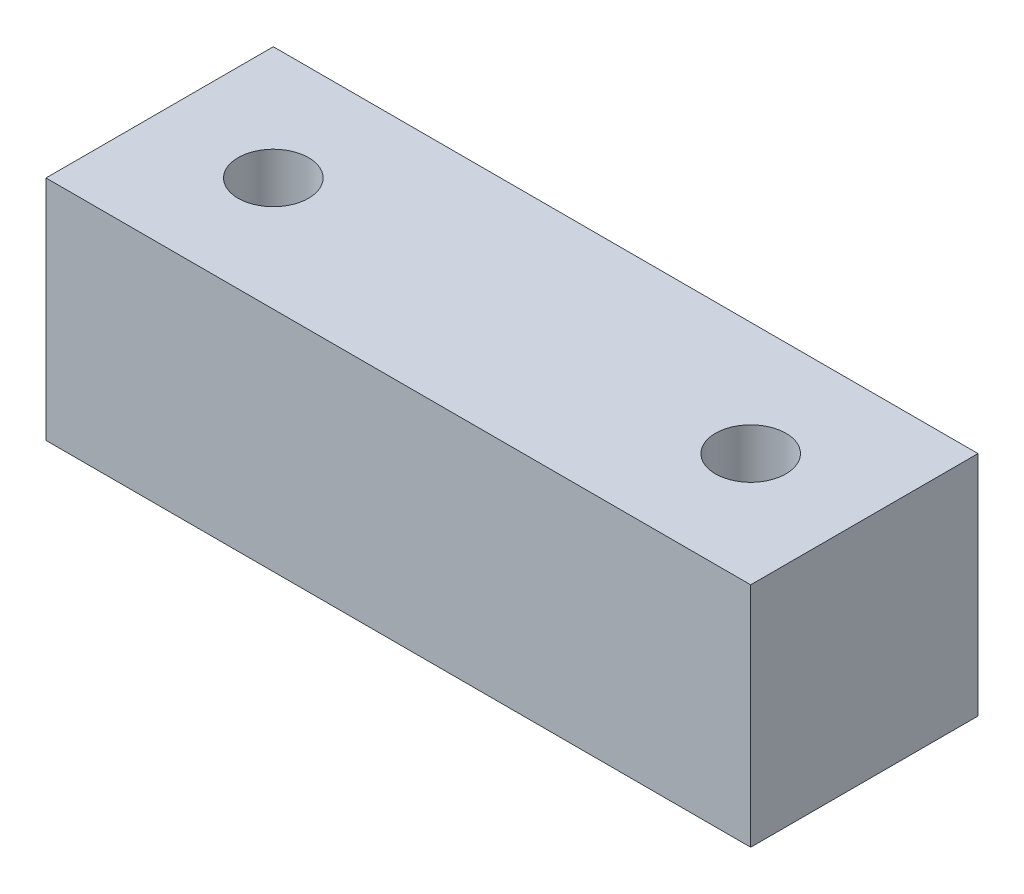
ISO-10303-21;
HEADER;
FILE_DESCRIPTION(('STEP AP214'),'2;1');
FILE_NAME('part.step','',(''),(''),'','','');
FILE_SCHEMA(('AUTOMOTIVE_DESIGN { 1 0 10303 214 1 1 1 1 }'));
ENDSEC;
DATA;
#1=APPLICATION_CONTEXT('core data for automotive mechanical design processes');
#2=APPLICATION_PROTOCOL_DEFINITION('international standard','automotive_design',2000,#1);
#3=PRODUCT_CONTEXT('',#1,'mechanical');
#4=PRODUCT('Part','Part','',(#3));
#5=PRODUCT_RELATED_PRODUCT_CATEGORY('part','',(#4));
#6=PRODUCT_DEFINITION_FORMATION('','',#4);
#7=PRODUCT_DEFINITION_CONTEXT('part definition',#1,'design');
#8=PRODUCT_DEFINITION('design','',#6,#7);
#9=PRODUCT_DEFINITION_SHAPE('','',#8);
#10=(LENGTH_UNIT() NAMED_UNIT(*) SI_UNIT(.MILLI.,.METRE.));
#11=(NAMED_UNIT(*) PLANE_ANGLE_UNIT() SI_UNIT($,.RADIAN.));
#12=(NAMED_UNIT(*) SI_UNIT($,.STERADIAN.) SOLID_ANGLE_UNIT());
#13=UNCERTAINTY_MEASURE_WITH_UNIT(LENGTH_MEASURE(1.E-05),#10,'distance_accuracy_value','');
#14=(GEOMETRIC_REPRESENTATION_CONTEXT(3) GLOBAL_UNCERTAINTY_ASSIGNED_CONTEXT((#13)) GLOBAL_UNIT_ASSIGNED_CONTEXT((#10,
#11,#12)) REPRESENTATION_CONTEXT('',''));
#15=CARTESIAN_POINT('',(0.,0.,0.));
#16=DIRECTION('',(0.,0.,1.));
#17=DIRECTION('',(1.,0.,0.));
#18=AXIS2_PLACEMENT_3D('',#15,#16,#17);
#19=CARTESIAN_POINT('',(15.5,10.,5.));
#20=DIRECTION('',(-1.,0.,0.));
#21=DIRECTION('',(0.,0.,1.));
#22=AXIS2_PLACEMENT_3D('',#19,#20,#21);
#23=PLANE('',#22);
#24=DIRECTION('',(0.,0.,-1.));
#25=VECTOR('',#24,1.);
#26=CARTESIAN_POINT('',(15.5,0.,5.));
#27=LINE('',#26,#25);
#28=CARTESIAN_POINT('',(15.5,0.,5.));
#29=VERTEX_POINT('',#28);
#30=CARTESIAN_POINT('',(15.5,0.,-5.));
#31=VERTEX_POINT('',#30);
#32=EDGE_CURVE('E118',#29,#31,#27,.T.);
#33=ORIENTED_EDGE('',*,*,#32,.T.);
#34=DIRECTION('',(0.,-1.,0.));
#35=VECTOR('',#34,1.);
#36=CARTESIAN_POINT('',(15.5,10.,-5.));
#37=LINE('',#36,#35);
#38=CARTESIAN_POINT('',(15.5,10.,-5.));
#39=VERTEX_POINT('',#38);
#40=EDGE_CURVE('E12',#39,#31,#37,.T.);
#41=ORIENTED_EDGE('',*,*,#40,.F.);
#42=DIRECTION('',(0.,0.,-1.));
#43=VECTOR('',#42,1.);
#44=CARTESIAN_POINT('',(15.5,10.,5.));
#45=LINE('',#44,#43);
#46=CARTESIAN_POINT('',(15.5,10.,5.));
#47=VERTEX_POINT('',#46);
#48=EDGE_CURVE('E90',#47,#39,#45,.T.);
#49=ORIENTED_EDGE('',*,*,#48,.F.);
#50=DIRECTION('',(0.,-1.,0.));
#51=VECTOR('',#50,1.);
#52=CARTESIAN_POINT('',(15.5,10.,5.));
#53=LINE('',#52,#51);
#54=EDGE_CURVE('E98',#47,#29,#53,.T.);
#55=ORIENTED_EDGE('',*,*,#54,.T.);
#56=EDGE_LOOP('',(#33,#41,#49,#55));
#57=FACE_BOUND('',#56,.T.);
#58=ADVANCED_FACE('F39',(#57),#23,.F.);
#59=CARTESIAN_POINT('',(-15.5,10.,-5.));
#60=DIRECTION('',(0.,0.,1.));
#61=DIRECTION('',(1.,0.,0.));
#62=AXIS2_PLACEMENT_3D('',#59,#60,#61);
#63=PLANE('',#62);
#64=DIRECTION('',(-1.,0.,0.));
#65=VECTOR('',#64,1.);
#66=CARTESIAN_POINT('',(-15.5,0.,-5.));
#67=LINE('',#66,#65);
#68=CARTESIAN_POINT('',(-15.5,0.,-5.));
#69=VERTEX_POINT('',#68);
#70=EDGE_CURVE('E94',#31,#69,#67,.T.);
#71=ORIENTED_EDGE('',*,*,#70,.T.);
#72=DIRECTION('',(0.,-1.,0.));
#73=VECTOR('',#72,1.);
#74=CARTESIAN_POINT('',(-15.5,10.,-5.));
#75=LINE('',#74,#73);
#76=CARTESIAN_POINT('',(-15.5,10.,-5.));
#77=VERTEX_POINT('',#76);
#78=EDGE_CURVE('E47',#77,#69,#75,.T.);
#79=ORIENTED_EDGE('',*,*,#78,.F.);
#80=DIRECTION('',(-1.,0.,0.));
#81=VECTOR('',#80,1.);
#82=CARTESIAN_POINT('',(-15.5,10.,-5.));
#83=LINE('',#82,#81);
#84=EDGE_CURVE('E85',#39,#77,#83,.T.);
#85=ORIENTED_EDGE('',*,*,#84,.F.);
#86=ORIENTED_EDGE('',*,*,#40,.T.);
#87=EDGE_LOOP('',(#71,#79,#85,#86));
#88=FACE_BOUND('',#87,.T.);
#89=ADVANCED_FACE('F93',(#88),#63,.F.);
#90=CARTESIAN_POINT('',(-15.5,10.,5.));
#91=DIRECTION('',(1.,0.,0.));
#92=DIRECTION('',(0.,0.,-1.));
#93=AXIS2_PLACEMENT_3D('',#90,#91,#92);
#94=PLANE('',#93);
#95=DIRECTION('',(0.,0.,1.));
#96=VECTOR('',#95,1.);
#97=CARTESIAN_POINT('',(-15.5,0.,5.));
#98=LINE('',#97,#96);
#99=CARTESIAN_POINT('',(-15.5,0.,5.));
#100=VERTEX_POINT('',#99);
#101=EDGE_CURVE('E72',#69,#100,#98,.T.);
#102=ORIENTED_EDGE('',*,*,#101,.T.);
#103=DIRECTION('',(0.,-1.,0.));
#104=VECTOR('',#103,1.);
#105=CARTESIAN_POINT('',(-15.5,10.,5.));
#106=LINE('',#105,#104);
#107=CARTESIAN_POINT('',(-15.5,10.,5.));
#108=VERTEX_POINT('',#107);
#109=EDGE_CURVE('E95',#108,#100,#106,.T.);
#110=ORIENTED_EDGE('',*,*,#109,.F.);
#111=DIRECTION('',(0.,0.,1.));
#112=VECTOR('',#111,1.);
#113=CARTESIAN_POINT('',(-15.5,10.,5.));
#114=LINE('',#113,#112);
#115=EDGE_CURVE('E88',#77,#108,#114,.T.);
#116=ORIENTED_EDGE('',*,*,#115,.F.);
#117=ORIENTED_EDGE('',*,*,#78,.T.);
#118=EDGE_LOOP('',(#102,#110,#116,#117));
#119=FACE_BOUND('',#118,.T.);
#120=ADVANCED_FACE('F96',(#119),#94,.F.);
#121=CARTESIAN_POINT('',(-15.5,10.,5.));
#122=DIRECTION('',(0.,0.,-1.));
#123=DIRECTION('',(-1.,0.,0.));
#124=AXIS2_PLACEMENT_3D('',#121,#122,#123);
#125=PLANE('',#124);
#126=DIRECTION('',(1.,0.,0.));
#127=VECTOR('',#126,1.);
#128=CARTESIAN_POINT('',(-15.5,0.,5.));
#129=LINE('',#128,#127);
#130=EDGE_CURVE('E78',#100,#29,#129,.T.);
#131=ORIENTED_EDGE('',*,*,#130,.T.);
#132=ORIENTED_EDGE('',*,*,#54,.F.);
#133=DIRECTION('',(1.,0.,0.));
#134=VECTOR('',#133,1.);
#135=CARTESIAN_POINT('',(-15.5,10.,5.));
#136=LINE('',#135,#134);
#137=EDGE_CURVE('E55',#108,#47,#136,.T.);
#138=ORIENTED_EDGE('',*,*,#137,.F.);
#139=ORIENTED_EDGE('',*,*,#109,.T.);
#140=EDGE_LOOP('',(#131,#132,#138,#139));
#141=FACE_BOUND('',#140,.T.);
#142=ADVANCED_FACE('F138',(#141),#125,.F.);
#143=CARTESIAN_POINT('',(15.5,10.,-5.));
#144=DIRECTION('',(0.,-1.,0.));
#145=DIRECTION('',(0.,0.,-1.));
#146=AXIS2_PLACEMENT_3D('',#143,#144,#145);
#147=PLANE('',#146);
#148=CARTESIAN_POINT('',(10.5,10.,0.));
#149=DIRECTION('',(0.,1.,0.));
#150=DIRECTION('',(0.,0.,1.));
#151=AXIS2_PLACEMENT_3D('',#148,#149,#150);
#152=CIRCLE('',#151,1.55);
#153=CARTESIAN_POINT('',(10.5,10.,1.55));
#154=VERTEX_POINT('',#153);
#155=EDGE_CURVE('E119',#154,#154,#152,.T.);
#156=ORIENTED_EDGE('',*,*,#155,.F.);
#157=EDGE_LOOP('',(#156));
#158=FACE_BOUND('',#157,.T.);
#159=CARTESIAN_POINT('',(-10.5,10.,0.));
#160=DIRECTION('',(0.,1.,0.));
#161=DIRECTION('',(0.,0.,1.));
#162=AXIS2_PLACEMENT_3D('',#159,#160,#161);
#163=CIRCLE('',#162,1.55);
#164=CARTESIAN_POINT('',(-10.5,10.,1.55));
#165=VERTEX_POINT('',#164);
#166=EDGE_CURVE('E110',#165,#165,#163,.T.);
#167=ORIENTED_EDGE('',*,*,#166,.F.);
#168=EDGE_LOOP('',(#167));
#169=FACE_BOUND('',#168,.T.);
#170=ORIENTED_EDGE('',*,*,#48,.T.);
#171=ORIENTED_EDGE('',*,*,#84,.T.);
#172=ORIENTED_EDGE('',*,*,#115,.T.);
#173=ORIENTED_EDGE('',*,*,#137,.T.);
#174=EDGE_LOOP('',(#170,#171,#172,#173));
#175=FACE_BOUND('',#174,.T.);
#176=ADVANCED_FACE('F86',(#158,#169,#175),#147,.F.);
#177=CARTESIAN_POINT('',(15.5,0.,-5.));
#178=DIRECTION('',(0.,-1.,0.));
#179=DIRECTION('',(0.,0.,-1.));
#180=AXIS2_PLACEMENT_3D('',#177,#178,#179);
#181=PLANE('',#180);
#182=CARTESIAN_POINT('',(10.5,0.,0.));
#183=DIRECTION('',(0.,1.,0.));
#184=DIRECTION('',(0.,0.,1.));
#185=AXIS2_PLACEMENT_3D('',#182,#183,#184);
#186=CIRCLE('',#185,1.55);
#187=CARTESIAN_POINT('',(10.5,0.,1.55));
#188=VERTEX_POINT('',#187);
#189=EDGE_CURVE('E115',#188,#188,#186,.T.);
#190=ORIENTED_EDGE('',*,*,#189,.T.);
#191=EDGE_LOOP('',(#190));
#192=FACE_BOUND('',#191,.T.);
#193=CARTESIAN_POINT('',(-10.5,0.,0.));
#194=DIRECTION('',(0.,1.,0.));
#195=DIRECTION('',(0.,0.,1.));
#196=AXIS2_PLACEMENT_3D('',#193,#194,#195);
#197=CIRCLE('',#196,1.55);
#198=CARTESIAN_POINT('',(-10.5,0.,1.55));
#199=VERTEX_POINT('',#198);
#200=EDGE_CURVE('E114',#199,#199,#197,.T.);
#201=ORIENTED_EDGE('',*,*,#200,.T.);
#202=EDGE_LOOP('',(#201));
#203=FACE_BOUND('',#202,.T.);
#204=ORIENTED_EDGE('',*,*,#32,.F.);
#205=ORIENTED_EDGE('',*,*,#130,.F.);
#206=ORIENTED_EDGE('',*,*,#101,.F.);
#207=ORIENTED_EDGE('',*,*,#70,.F.);
#208=EDGE_LOOP('',(#204,#205,#206,#207));
#209=FACE_BOUND('',#208,.T.);
#210=ADVANCED_FACE('F126',(#192,#203,#209),#181,.T.);
#211=CARTESIAN_POINT('',(-10.5,0.,0.));
#212=DIRECTION('',(0.,1.,0.));
#213=DIRECTION('',(0.,0.,1.));
#214=AXIS2_PLACEMENT_3D('',#211,#212,#213);
#215=CYLINDRICAL_SURFACE('',#214,1.55);
#216=ORIENTED_EDGE('',*,*,#200,.F.);
#217=EDGE_LOOP('',(#216));
#218=FACE_BOUND('',#217,.T.);
#219=ORIENTED_EDGE('',*,*,#166,.T.);
#220=EDGE_LOOP('',(#219));
#221=FACE_BOUND('',#220,.T.);
#222=ADVANCED_FACE('F132',(#218,#221),#215,.F.);
#223=CARTESIAN_POINT('',(10.5,0.,0.));
#224=DIRECTION('',(0.,1.,0.));
#225=DIRECTION('',(0.,0.,1.));
#226=AXIS2_PLACEMENT_3D('',#223,#224,#225);
#227=CYLINDRICAL_SURFACE('',#226,1.55);
#228=ORIENTED_EDGE('',*,*,#189,.F.);
#229=EDGE_LOOP('',(#228));
#230=FACE_BOUND('',#229,.T.);
#231=ORIENTED_EDGE('',*,*,#155,.T.);
#232=EDGE_LOOP('',(#231));
#233=FACE_BOUND('',#232,.T.);
#234=ADVANCED_FACE('F129',(#230,#233),#227,.F.);
#235=CLOSED_SHELL('',(#58,#89,#120,#142,#176,#210,#222,#234));
#236=MANIFOLD_SOLID_BREP('B2',#235);
#237=ADVANCED_BREP_SHAPE_REPRESENTATION('',(#18,#236),#14);
#238=SHAPE_DEFINITION_REPRESENTATION(#9,#237);
ENDSEC;
END-ISO-10303-21;
